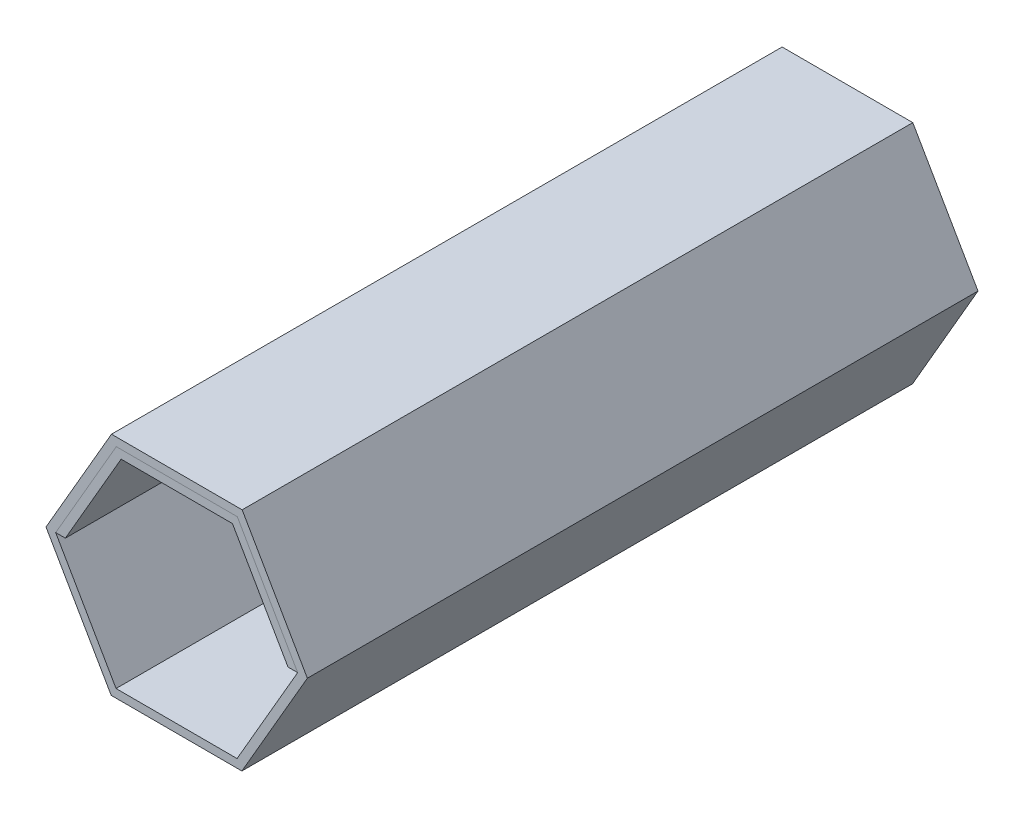
ISO-10303-21;
HEADER;
FILE_DESCRIPTION(('STEP AP214'),'2;1');
FILE_NAME('part.step','',(''),(''),'','','');
FILE_SCHEMA(('AUTOMOTIVE_DESIGN { 1 0 10303 214 1 1 1 1 }'));
ENDSEC;
DATA;
#1=APPLICATION_CONTEXT('core data for automotive mechanical design processes');
#2=APPLICATION_PROTOCOL_DEFINITION('international standard','automotive_design',2000,#1);
#3=PRODUCT_CONTEXT('',#1,'mechanical');
#4=PRODUCT('Part','Part','',(#3));
#5=PRODUCT_RELATED_PRODUCT_CATEGORY('part','',(#4));
#6=PRODUCT_DEFINITION_FORMATION('','',#4);
#7=PRODUCT_DEFINITION_CONTEXT('part definition',#1,'design');
#8=PRODUCT_DEFINITION('design','',#6,#7);
#9=PRODUCT_DEFINITION_SHAPE('','',#8);
#10=(LENGTH_UNIT() NAMED_UNIT(*) SI_UNIT(.MILLI.,.METRE.));
#11=(NAMED_UNIT(*) PLANE_ANGLE_UNIT() SI_UNIT($,.RADIAN.));
#12=(NAMED_UNIT(*) SI_UNIT($,.STERADIAN.) SOLID_ANGLE_UNIT());
#13=UNCERTAINTY_MEASURE_WITH_UNIT(LENGTH_MEASURE(1.E-05),#10,'distance_accuracy_value','');
#14=(GEOMETRIC_REPRESENTATION_CONTEXT(3) GLOBAL_UNCERTAINTY_ASSIGNED_CONTEXT((#13)) GLOBAL_UNIT_ASSIGNED_CONTEXT((#10,
#11,#12)) REPRESENTATION_CONTEXT('',''));
#15=CARTESIAN_POINT('',(0.,0.,0.));
#16=DIRECTION('',(0.,0.,1.));
#17=DIRECTION('',(1.,0.,0.));
#18=AXIS2_PLACEMENT_3D('',#15,#16,#17);
#19=CARTESIAN_POINT('',(-10.8178285685141,6.26295338177121,80.));
#20=DIRECTION('',(0.865426285481131,-0.501036270541697,0.));
#21=DIRECTION('',(0.501036270541697,0.865426285481131,0.));
#22=AXIS2_PLACEMENT_3D('',#19,#20,#21);
#23=PLANE('',#22);
#24=DIRECTION('',(-0.501036270541697,-0.865426285481131,0.));
#25=VECTOR('',#24,1.);
#26=CARTESIAN_POINT('',(-10.8178285685141,6.26295338177121,0.));
#27=LINE('',#26,#25);
#28=CARTESIAN_POINT('',(-7.20191074762645,12.5086296178501,0.));
#29=VERTEX_POINT('',#28);
#30=CARTESIAN_POINT('',(-14.4337463894018,0.017277145692351,0.));
#31=VERTEX_POINT('',#30);
#32=EDGE_CURVE('E161',#29,#31,#27,.T.);
#33=ORIENTED_EDGE('',*,*,#32,.T.);
#34=DIRECTION('',(0.,0.,-1.));
#35=VECTOR('',#34,1.);
#36=CARTESIAN_POINT('',(-14.4337463894018,0.017277145692351,80.));
#37=LINE('',#36,#35);
#38=CARTESIAN_POINT('',(-14.4337463894018,0.017277145692351,80.));
#39=VERTEX_POINT('',#38);
#40=EDGE_CURVE('E12',#39,#31,#37,.T.);
#41=ORIENTED_EDGE('',*,*,#40,.F.);
#42=DIRECTION('',(-0.501036270541697,-0.865426285481131,0.));
#43=VECTOR('',#42,1.);
#44=CARTESIAN_POINT('',(-10.8178285685141,6.26295338177121,80.));
#45=LINE('',#44,#43);
#46=CARTESIAN_POINT('',(-7.20191074762645,12.5086296178501,80.));
#47=VERTEX_POINT('',#46);
#48=EDGE_CURVE('E179',#47,#39,#45,.T.);
#49=ORIENTED_EDGE('',*,*,#48,.F.);
#50=DIRECTION('',(0.,0.,-1.));
#51=VECTOR('',#50,1.);
#52=CARTESIAN_POINT('',(-7.20191074762645,12.5086296178501,80.));
#53=LINE('',#52,#51);
#54=EDGE_CURVE('E160',#47,#29,#53,.T.);
#55=ORIENTED_EDGE('',*,*,#54,.T.);
#56=EDGE_LOOP('',(#33,#41,#49,#55));
#57=FACE_BOUND('',#56,.T.);
#58=ADVANCED_FACE('F63',(#57),#23,.F.);
#59=CARTESIAN_POINT('',(0.,0.017277145692349,80.));
#60=DIRECTION('',(0.,1.,0.));
#61=DIRECTION('',(-1.,0.,0.));
#62=AXIS2_PLACEMENT_3D('',#59,#60,#61);
#63=PLANE('',#62);
#64=DIRECTION('',(1.,0.,0.));
#65=VECTOR('',#64,1.);
#66=CARTESIAN_POINT('',(0.,0.017277145692349,0.));
#67=LINE('',#66,#65);
#68=CARTESIAN_POINT('',(-13.2782464736071,0.017277145692351,0.));
#69=VERTEX_POINT('',#68);
#70=EDGE_CURVE('E164',#31,#69,#67,.T.);
#71=ORIENTED_EDGE('',*,*,#70,.T.);
#72=DIRECTION('',(0.,0.,-1.));
#73=VECTOR('',#72,1.);
#74=CARTESIAN_POINT('',(-13.2782464736071,0.017277145692351,80.));
#75=LINE('',#74,#73);
#76=CARTESIAN_POINT('',(-13.2782464736071,0.017277145692351,80.));
#77=VERTEX_POINT('',#76);
#78=EDGE_CURVE('E71',#77,#69,#75,.T.);
#79=ORIENTED_EDGE('',*,*,#78,.F.);
#80=DIRECTION('',(1.,0.,0.));
#81=VECTOR('',#80,1.);
#82=CARTESIAN_POINT('',(0.,0.017277145692349,80.));
#83=LINE('',#82,#81);
#84=EDGE_CURVE('E121',#39,#77,#83,.T.);
#85=ORIENTED_EDGE('',*,*,#84,.F.);
#86=ORIENTED_EDGE('',*,*,#40,.T.);
#87=EDGE_LOOP('',(#71,#79,#85,#86));
#88=FACE_BOUND('',#87,.T.);
#89=ADVANCED_FACE('F192',(#88),#63,.F.);
#90=CARTESIAN_POINT('',(-9.952402283033,5.76191711122951,80.));
#91=DIRECTION('',(0.865426285481131,-0.501036270541697,0.));
#92=DIRECTION('',(0.501036270541697,0.865426285481131,0.));
#93=AXIS2_PLACEMENT_3D('',#90,#91,#92);
#94=PLANE('',#93);
#95=DIRECTION('',(-0.501036270541697,-0.865426285481131,0.));
#96=VECTOR('',#95,1.);
#97=CARTESIAN_POINT('',(-9.952402283033,5.76191711122951,0.));
#98=LINE('',#97,#96);
#99=CARTESIAN_POINT('',(-6.62575788781633,11.5079392484221,0.));
#100=VERTEX_POINT('',#99);
#101=EDGE_CURVE('E167',#100,#69,#98,.T.);
#102=ORIENTED_EDGE('',*,*,#101,.F.);
#103=DIRECTION('',(0.,0.,-1.));
#104=VECTOR('',#103,1.);
#105=CARTESIAN_POINT('',(-6.62575788781633,11.5079392484221,80.));
#106=LINE('',#105,#104);
#107=CARTESIAN_POINT('',(-6.62575788781633,11.5079392484221,80.));
#108=VERTEX_POINT('',#107);
#109=EDGE_CURVE('E185',#108,#100,#106,.T.);
#110=ORIENTED_EDGE('',*,*,#109,.F.);
#111=DIRECTION('',(-0.501036270541697,-0.865426285481131,0.));
#112=VECTOR('',#111,1.);
#113=CARTESIAN_POINT('',(-9.952402283033,5.76191711122951,80.));
#114=LINE('',#113,#112);
#115=EDGE_CURVE('E191',#108,#77,#114,.T.);
#116=ORIENTED_EDGE('',*,*,#115,.T.);
#117=ORIENTED_EDGE('',*,*,#78,.T.);
#118=EDGE_LOOP('',(#102,#110,#116,#117));
#119=FACE_BOUND('',#118,.T.);
#120=ADVANCED_FACE('F189',(#119),#94,.T.);
#121=CARTESIAN_POINT('',(0.0137654513085009,11.4999917614036,80.));
#122=DIRECTION('',(-0.0011969957659566,-0.999999283600312,0.));
#123=DIRECTION('',(0.999999283600312,-0.0011969957659566,0.));
#124=AXIS2_PLACEMENT_3D('',#121,#122,#123);
#125=PLANE('',#124);
#126=DIRECTION('',(-0.999999283600312,0.0011969957659566,0.));
#127=VECTOR('',#126,1.);
#128=CARTESIAN_POINT('',(0.0137654513085009,11.4999917614036,0.));
#129=LINE('',#128,#127);
#130=CARTESIAN_POINT('',(6.65328879043334,11.4920442743851,0.));
#131=VERTEX_POINT('',#130);
#132=EDGE_CURVE('E170',#131,#100,#129,.T.);
#133=ORIENTED_EDGE('',*,*,#132,.F.);
#134=DIRECTION('',(0.,0.,-1.));
#135=VECTOR('',#134,1.);
#136=CARTESIAN_POINT('',(6.65328879043334,11.4920442743851,80.));
#137=LINE('',#136,#135);
#138=CARTESIAN_POINT('',(6.65328879043334,11.4920442743851,80.));
#139=VERTEX_POINT('',#138);
#140=EDGE_CURVE('E183',#139,#131,#137,.T.);
#141=ORIENTED_EDGE('',*,*,#140,.F.);
#142=DIRECTION('',(-0.999999283600312,0.0011969957659566,0.));
#143=VECTOR('',#142,1.);
#144=CARTESIAN_POINT('',(0.0137654513085009,11.4999917614036,80.));
#145=LINE('',#144,#143);
#146=EDGE_CURVE('E155',#139,#108,#145,.T.);
#147=ORIENTED_EDGE('',*,*,#146,.T.);
#148=ORIENTED_EDGE('',*,*,#109,.T.);
#149=EDGE_LOOP('',(#133,#141,#147,#148));
#150=FACE_BOUND('',#149,.T.);
#151=ADVANCED_FACE('F200',(#150),#125,.T.);
#152=CARTESIAN_POINT('',(9.9661677343415,5.73807465017407,80.));
#153=DIRECTION('',(-0.866623281247087,-0.498963013058615,0.));
#154=DIRECTION('',(0.498963013058615,-0.866623281247087,0.));
#155=AXIS2_PLACEMENT_3D('',#152,#153,#154);
#156=PLANE('',#155);
#157=DIRECTION('',(-0.498963013058615,0.866623281247087,0.));
#158=VECTOR('',#157,1.);
#159=CARTESIAN_POINT('',(9.9661677343415,5.73807465017407,0.));
#160=LINE('',#159,#158);
#161=CARTESIAN_POINT('',(13.2798424710107,-0.0172771456923517,0.));
#162=VERTEX_POINT('',#161);
#163=EDGE_CURVE('E173',#162,#131,#160,.T.);
#164=ORIENTED_EDGE('',*,*,#163,.F.);
#165=DIRECTION('',(0.,0.,-1.));
#166=VECTOR('',#165,1.);
#167=CARTESIAN_POINT('',(13.2798424710107,-0.0172771456923517,80.));
#168=LINE('',#167,#166);
#169=CARTESIAN_POINT('',(13.2798424710107,-0.0172771456923517,80.));
#170=VERTEX_POINT('',#169);
#171=EDGE_CURVE('E143',#170,#162,#168,.T.);
#172=ORIENTED_EDGE('',*,*,#171,.F.);
#173=DIRECTION('',(-0.498963013058615,0.866623281247087,0.));
#174=VECTOR('',#173,1.);
#175=CARTESIAN_POINT('',(9.9661677343415,5.73807465017407,80.));
#176=LINE('',#175,#174);
#177=EDGE_CURVE('E153',#170,#139,#176,.T.);
#178=ORIENTED_EDGE('',*,*,#177,.T.);
#179=ORIENTED_EDGE('',*,*,#140,.T.);
#180=EDGE_LOOP('',(#164,#172,#178,#179));
#181=FACE_BOUND('',#180,.T.);
#182=ADVANCED_FACE('F230',(#181),#156,.T.);
#183=CARTESIAN_POINT('',(0.,-0.0172771456923529,80.));
#184=DIRECTION('',(0.,-1.,0.));
#185=DIRECTION('',(1.,0.,0.));
#186=AXIS2_PLACEMENT_3D('',#183,#184,#185);
#187=PLANE('',#186);
#188=DIRECTION('',(-1.,0.,0.));
#189=VECTOR('',#188,1.);
#190=CARTESIAN_POINT('',(0.,-0.0172771456923529,0.));
#191=LINE('',#190,#189);
#192=CARTESIAN_POINT('',(14.4337463894018,-0.0172771456923519,0.));
#193=VERTEX_POINT('',#192);
#194=EDGE_CURVE('E142',#193,#162,#191,.T.);
#195=ORIENTED_EDGE('',*,*,#194,.F.);
#196=DIRECTION('',(0.,0.,-1.));
#197=VECTOR('',#196,1.);
#198=CARTESIAN_POINT('',(14.4337463894018,-0.0172771456923519,80.));
#199=LINE('',#198,#197);
#200=CARTESIAN_POINT('',(14.4337463894018,-0.0172771456923519,80.));
#201=VERTEX_POINT('',#200);
#202=EDGE_CURVE('E136',#201,#193,#199,.T.);
#203=ORIENTED_EDGE('',*,*,#202,.F.);
#204=DIRECTION('',(-1.,0.,0.));
#205=VECTOR('',#204,1.);
#206=CARTESIAN_POINT('',(0.,-0.0172771456923529,80.));
#207=LINE('',#206,#205);
#208=EDGE_CURVE('E140',#201,#170,#207,.T.);
#209=ORIENTED_EDGE('',*,*,#208,.T.);
#210=ORIENTED_EDGE('',*,*,#171,.T.);
#211=EDGE_LOOP('',(#195,#203,#209,#210));
#212=FACE_BOUND('',#211,.T.);
#213=ADVANCED_FACE('F138',(#212),#187,.T.);
#214=CARTESIAN_POINT('',(10.8327910155886,6.23703766323269,80.));
#215=DIRECTION('',(-0.866623281247087,-0.498963013058615,0.));
#216=DIRECTION('',(0.498963013058615,-0.866623281247087,0.));
#217=AXIS2_PLACEMENT_3D('',#214,#215,#216);
#218=PLANE('',#217);
#219=DIRECTION('',(-0.498963013058615,0.866623281247087,0.));
#220=VECTOR('',#219,1.);
#221=CARTESIAN_POINT('',(10.8327910155886,6.23703766323269,0.));
#222=LINE('',#221,#220);
#223=CARTESIAN_POINT('',(7.23183564177536,12.4913524721577,0.));
#224=VERTEX_POINT('',#223);
#225=EDGE_CURVE('E107',#193,#224,#222,.T.);
#226=ORIENTED_EDGE('',*,*,#225,.T.);
#227=DIRECTION('',(0.,0.,-1.));
#228=VECTOR('',#227,1.);
#229=CARTESIAN_POINT('',(7.23183564177536,12.4913524721577,80.));
#230=LINE('',#229,#228);
#231=CARTESIAN_POINT('',(7.23183564177536,12.4913524721577,80.));
#232=VERTEX_POINT('',#231);
#233=EDGE_CURVE('E144',#232,#224,#230,.T.);
#234=ORIENTED_EDGE('',*,*,#233,.F.);
#235=DIRECTION('',(-0.498963013058615,0.866623281247087,0.));
#236=VECTOR('',#235,1.);
#237=CARTESIAN_POINT('',(10.8327910155886,6.23703766323269,80.));
#238=LINE('',#237,#236);
#239=EDGE_CURVE('E146',#201,#232,#238,.T.);
#240=ORIENTED_EDGE('',*,*,#239,.F.);
#241=ORIENTED_EDGE('',*,*,#202,.T.);
#242=EDGE_LOOP('',(#226,#234,#240,#241));
#243=FACE_BOUND('',#242,.T.);
#244=ADVANCED_FACE('F147',(#243),#218,.F.);
#245=CARTESIAN_POINT('',(0.0149624470744586,12.4999910450039,80.));
#246=DIRECTION('',(-0.00119699576595669,-0.999999283600312,0.));
#247=DIRECTION('',(0.999999283600312,-0.00119699576595669,0.));
#248=AXIS2_PLACEMENT_3D('',#245,#246,#247);
#249=PLANE('',#248);
#250=DIRECTION('',(-0.999999283600312,0.00119699576595669,0.));
#251=VECTOR('',#250,1.);
#252=CARTESIAN_POINT('',(0.0149624470744586,12.4999910450039,0.));
#253=LINE('',#252,#251);
#254=EDGE_CURVE('E113',#224,#29,#253,.T.);
#255=ORIENTED_EDGE('',*,*,#254,.T.);
#256=ORIENTED_EDGE('',*,*,#54,.F.);
#257=DIRECTION('',(-0.999999283600312,0.00119699576595669,0.));
#258=VECTOR('',#257,1.);
#259=CARTESIAN_POINT('',(0.0149624470744586,12.4999910450039,80.));
#260=LINE('',#259,#258);
#261=EDGE_CURVE('E79',#232,#47,#260,.T.);
#262=ORIENTED_EDGE('',*,*,#261,.F.);
#263=ORIENTED_EDGE('',*,*,#233,.T.);
#264=EDGE_LOOP('',(#255,#256,#262,#263));
#265=FACE_BOUND('',#264,.T.);
#266=ADVANCED_FACE('F207',(#265),#249,.F.);
#267=CARTESIAN_POINT('',(0.,0.,80.));
#268=DIRECTION('',(0.,0.,1.));
#269=DIRECTION('',(1.,0.,0.));
#270=AXIS2_PLACEMENT_3D('',#267,#268,#269);
#271=PLANE('',#270);
#272=ORIENTED_EDGE('',*,*,#48,.T.);
#273=ORIENTED_EDGE('',*,*,#84,.T.);
#274=ORIENTED_EDGE('',*,*,#115,.F.);
#275=ORIENTED_EDGE('',*,*,#146,.F.);
#276=ORIENTED_EDGE('',*,*,#177,.F.);
#277=ORIENTED_EDGE('',*,*,#208,.F.);
#278=ORIENTED_EDGE('',*,*,#239,.T.);
#279=ORIENTED_EDGE('',*,*,#261,.T.);
#280=EDGE_LOOP('',(#272,#273,#274,#275,#276,#277,#278,#279));
#281=FACE_BOUND('',#280,.T.);
#282=ADVANCED_FACE('F150',(#281),#271,.T.);
#283=CARTESIAN_POINT('',(0.,0.,0.));
#284=DIRECTION('',(0.,0.,1.));
#285=DIRECTION('',(1.,0.,0.));
#286=AXIS2_PLACEMENT_3D('',#283,#284,#285);
#287=PLANE('',#286);
#288=ORIENTED_EDGE('',*,*,#32,.F.);
#289=ORIENTED_EDGE('',*,*,#254,.F.);
#290=ORIENTED_EDGE('',*,*,#225,.F.);
#291=ORIENTED_EDGE('',*,*,#194,.T.);
#292=ORIENTED_EDGE('',*,*,#163,.T.);
#293=ORIENTED_EDGE('',*,*,#132,.T.);
#294=ORIENTED_EDGE('',*,*,#101,.T.);
#295=ORIENTED_EDGE('',*,*,#70,.F.);
#296=EDGE_LOOP('',(#288,#289,#290,#291,#292,#293,#294,#295));
#297=FACE_BOUND('',#296,.T.);
#298=ADVANCED_FACE('F196',(#297),#287,.F.);
#299=CLOSED_SHELL('',(#58,#89,#120,#151,#182,#213,#244,#266,#282,#298));
#300=MANIFOLD_SOLID_BREP('B2',#299);
#301=CARTESIAN_POINT('',(11.6832548539953,-6.7639896523129,80.));
#302=DIRECTION('',(-0.865426285481131,0.501036270541697,0.));
#303=DIRECTION('',(-0.501036270541697,-0.865426285481131,0.));
#304=AXIS2_PLACEMENT_3D('',#301,#302,#303);
#305=PLANE('',#304);
#306=DIRECTION('',(0.501036270541697,0.865426285481131,0.));
#307=VECTOR('',#306,1.);
#308=CARTESIAN_POINT('',(11.6832548539953,-6.7639896523129,0.));
#309=LINE('',#308,#307);
#310=CARTESIAN_POINT('',(7.77806360743657,-13.5093199872781,0.));
#311=VERTEX_POINT('',#310);
#312=CARTESIAN_POINT('',(15.588446100554,-0.0186593173477391,0.));
#313=VERTEX_POINT('',#312);
#314=EDGE_CURVE('E486',#311,#313,#309,.T.);
#315=ORIENTED_EDGE('',*,*,#314,.T.);
#316=DIRECTION('',(0.,0.,-1.));
#317=VECTOR('',#316,1.);
#318=CARTESIAN_POINT('',(15.588446100554,-0.0186593173477391,80.));
#319=LINE('',#318,#317);
#320=CARTESIAN_POINT('',(15.588446100554,-0.0186593173477391,80.));
#321=VERTEX_POINT('',#320);
#322=EDGE_CURVE('E61',#321,#313,#319,.T.);
#323=ORIENTED_EDGE('',*,*,#322,.F.);
#324=DIRECTION('',(0.501036270541697,0.865426285481131,0.));
#325=VECTOR('',#324,1.);
#326=CARTESIAN_POINT('',(11.6832548539953,-6.7639896523129,80.));
#327=LINE('',#326,#325);
#328=CARTESIAN_POINT('',(7.77806360743657,-13.5093199872781,80.));
#329=VERTEX_POINT('',#328);
#330=EDGE_CURVE('E564',#329,#321,#327,.T.);
#331=ORIENTED_EDGE('',*,*,#330,.F.);
#332=DIRECTION('',(0.,0.,-1.));
#333=VECTOR('',#332,1.);
#334=CARTESIAN_POINT('',(7.77806360743657,-13.5093199872781,80.));
#335=LINE('',#334,#333);
#336=EDGE_CURVE('E503',#329,#311,#335,.T.);
#337=ORIENTED_EDGE('',*,*,#336,.T.);
#338=EDGE_LOOP('',(#315,#323,#331,#337));
#339=FACE_BOUND('',#338,.T.);
#340=ADVANCED_FACE('F333',(#339),#305,.F.);
#341=CARTESIAN_POINT('',(11.6994142968357,6.7360006762913,80.));
#342=DIRECTION('',(-0.866623281247087,-0.498963013058615,0.));
#343=DIRECTION('',(0.498963013058615,-0.866623281247087,0.));
#344=AXIS2_PLACEMENT_3D('',#341,#342,#343);
#345=PLANE('',#344);
#346=DIRECTION('',(-0.498963013058615,0.866623281247087,0.));
#347=VECTOR('',#346,1.);
#348=CARTESIAN_POINT('',(11.6994142968357,6.7360006762913,0.));
#349=LINE('',#348,#347);
#350=CARTESIAN_POINT('',(7.81038249311739,13.4906606699303,0.));
#351=VERTEX_POINT('',#350);
#352=EDGE_CURVE('E490',#313,#351,#349,.T.);
#353=ORIENTED_EDGE('',*,*,#352,.T.);
#354=DIRECTION('',(0.,0.,-1.));
#355=VECTOR('',#354,1.);
#356=CARTESIAN_POINT('',(7.81038249311739,13.4906606699303,80.));
#357=LINE('',#356,#355);
#358=CARTESIAN_POINT('',(7.81038249311739,13.4906606699303,80.));
#359=VERTEX_POINT('',#358);
#360=EDGE_CURVE('E344',#359,#351,#357,.T.);
#361=ORIENTED_EDGE('',*,*,#360,.F.);
#362=DIRECTION('',(-0.498963013058615,0.866623281247087,0.));
#363=VECTOR('',#362,1.);
#364=CARTESIAN_POINT('',(11.6994142968357,6.7360006762913,80.));
#365=LINE('',#364,#363);
#366=EDGE_CURVE('E567',#321,#359,#365,.T.);
#367=ORIENTED_EDGE('',*,*,#366,.F.);
#368=ORIENTED_EDGE('',*,*,#322,.T.);
#369=EDGE_LOOP('',(#353,#361,#367,#368));
#370=FACE_BOUND('',#369,.T.);
#371=ADVANCED_FACE('F574',(#370),#345,.F.);
#372=CARTESIAN_POINT('',(0.0161594428404147,13.4999903286042,80.));
#373=DIRECTION('',(-0.00119699576595665,-0.999999283600312,0.));
#374=DIRECTION('',(0.999999283600312,-0.00119699576595665,0.));
#375=AXIS2_PLACEMENT_3D('',#372,#373,#374);
#376=PLANE('',#375);
#377=DIRECTION('',(-0.999999283600312,0.00119699576595665,0.));
#378=VECTOR('',#377,1.);
#379=CARTESIAN_POINT('',(0.0161594428404147,13.4999903286042,0.));
#380=LINE('',#379,#378);
#381=CARTESIAN_POINT('',(-7.77806360743656,13.5093199872781,0.));
#382=VERTEX_POINT('',#381);
#383=EDGE_CURVE('E493',#351,#382,#380,.T.);
#384=ORIENTED_EDGE('',*,*,#383,.T.);
#385=DIRECTION('',(0.,0.,-1.));
#386=VECTOR('',#385,1.);
#387=CARTESIAN_POINT('',(-7.77806360743656,13.5093199872781,80.));
#388=LINE('',#387,#386);
#389=CARTESIAN_POINT('',(-7.77806360743656,13.5093199872781,80.));
#390=VERTEX_POINT('',#389);
#391=EDGE_CURVE('E451',#390,#382,#388,.T.);
#392=ORIENTED_EDGE('',*,*,#391,.F.);
#393=DIRECTION('',(-0.999999283600312,0.00119699576595665,0.));
#394=VECTOR('',#393,1.);
#395=CARTESIAN_POINT('',(0.0161594428404147,13.4999903286042,80.));
#396=LINE('',#395,#394);
#397=EDGE_CURVE('E440',#359,#390,#396,.T.);
#398=ORIENTED_EDGE('',*,*,#397,.F.);
#399=ORIENTED_EDGE('',*,*,#360,.T.);
#400=EDGE_LOOP('',(#384,#392,#398,#399));
#401=FACE_BOUND('',#400,.T.);
#402=ADVANCED_FACE('F577',(#401),#376,.F.);
#403=CARTESIAN_POINT('',(-11.6832548539953,6.76398965231291,80.));
#404=DIRECTION('',(0.865426285481131,-0.501036270541697,0.));
#405=DIRECTION('',(0.501036270541697,0.865426285481131,0.));
#406=AXIS2_PLACEMENT_3D('',#403,#404,#405);
#407=PLANE('',#406);
#408=DIRECTION('',(-0.501036270541697,-0.865426285481131,0.));
#409=VECTOR('',#408,1.);
#410=CARTESIAN_POINT('',(-11.6832548539953,6.76398965231291,0.));
#411=LINE('',#410,#409);
#412=CARTESIAN_POINT('',(-15.588446100554,0.01865931734774,0.));
#413=VERTEX_POINT('',#412);
#414=EDGE_CURVE('E449',#382,#413,#411,.T.);
#415=ORIENTED_EDGE('',*,*,#414,.T.);
#416=DIRECTION('',(0.,0.,-1.));
#417=VECTOR('',#416,1.);
#418=CARTESIAN_POINT('',(-15.588446100554,0.01865931734774,80.));
#419=LINE('',#418,#417);
#420=CARTESIAN_POINT('',(-15.588446100554,0.01865931734774,80.));
#421=VERTEX_POINT('',#420);
#422=EDGE_CURVE('E446',#421,#413,#419,.T.);
#423=ORIENTED_EDGE('',*,*,#422,.F.);
#424=DIRECTION('',(-0.501036270541697,-0.865426285481131,0.));
#425=VECTOR('',#424,1.);
#426=CARTESIAN_POINT('',(-11.6832548539953,6.76398965231291,80.));
#427=LINE('',#426,#425);
#428=EDGE_CURVE('E434',#390,#421,#427,.T.);
#429=ORIENTED_EDGE('',*,*,#428,.F.);
#430=ORIENTED_EDGE('',*,*,#391,.T.);
#431=EDGE_LOOP('',(#415,#423,#429,#430));
#432=FACE_BOUND('',#431,.T.);
#433=ADVANCED_FACE('F447',(#432),#407,.F.);
#434=CARTESIAN_POINT('',(-11.6994142968357,-6.7360006762913,80.));
#435=DIRECTION('',(0.866623281247088,0.498963013058615,0.));
#436=DIRECTION('',(-0.498963013058615,0.866623281247088,0.));
#437=AXIS2_PLACEMENT_3D('',#434,#435,#436);
#438=PLANE('',#437);
#439=DIRECTION('',(0.498963013058615,-0.866623281247088,0.));
#440=VECTOR('',#439,1.);
#441=CARTESIAN_POINT('',(-11.6994142968357,-6.7360006762913,0.));
#442=LINE('',#441,#440);
#443=CARTESIAN_POINT('',(-7.8103824931174,-13.4906606699303,0.));
#444=VERTEX_POINT('',#443);
#445=EDGE_CURVE('E394',#413,#444,#442,.T.);
#446=ORIENTED_EDGE('',*,*,#445,.T.);
#447=DIRECTION('',(0.,0.,-1.));
#448=VECTOR('',#447,1.);
#449=CARTESIAN_POINT('',(-7.8103824931174,-13.4906606699303,80.));
#450=LINE('',#449,#448);
#451=CARTESIAN_POINT('',(-7.8103824931174,-13.4906606699303,80.));
#452=VERTEX_POINT('',#451);
#453=EDGE_CURVE('E452',#452,#444,#450,.T.);
#454=ORIENTED_EDGE('',*,*,#453,.F.);
#455=DIRECTION('',(0.498963013058615,-0.866623281247088,0.));
#456=VECTOR('',#455,1.);
#457=CARTESIAN_POINT('',(-11.6994142968357,-6.7360006762913,80.));
#458=LINE('',#457,#456);
#459=EDGE_CURVE('E438',#421,#452,#458,.T.);
#460=ORIENTED_EDGE('',*,*,#459,.F.);
#461=ORIENTED_EDGE('',*,*,#422,.T.);
#462=EDGE_LOOP('',(#446,#454,#460,#461));
#463=FACE_BOUND('',#462,.T.);
#464=ADVANCED_FACE('F454',(#463),#438,.F.);
#465=CARTESIAN_POINT('',(10.8327910155886,6.23703766323269,80.));
#466=DIRECTION('',(-0.866623281247087,-0.498963013058615,0.));
#467=DIRECTION('',(0.498963013058615,-0.866623281247087,0.));
#468=AXIS2_PLACEMENT_3D('',#465,#466,#467);
#469=PLANE('',#468);
#470=DIRECTION('',(-0.498963013058615,0.866623281247087,0.));
#471=VECTOR('',#470,1.);
#472=CARTESIAN_POINT('',(10.8327910155886,6.23703766323269,0.));
#473=LINE('',#472,#471);
#474=CARTESIAN_POINT('',(14.4337463894018,-0.0172771456923519,0.));
#475=VERTEX_POINT('',#474);
#476=CARTESIAN_POINT('',(7.23183564177536,12.4913524721577,0.));
#477=VERTEX_POINT('',#476);
#478=EDGE_CURVE('E462',#475,#477,#473,.T.);
#479=ORIENTED_EDGE('',*,*,#478,.F.);
#480=DIRECTION('',(0.,0.,-1.));
#481=VECTOR('',#480,1.);
#482=CARTESIAN_POINT('',(14.4337463894018,-0.0172771456923519,80.));
#483=LINE('',#482,#481);
#484=CARTESIAN_POINT('',(14.4337463894018,-0.0172771456923519,80.));
#485=VERTEX_POINT('',#484);
#486=EDGE_CURVE('E337',#485,#475,#483,.T.);
#487=ORIENTED_EDGE('',*,*,#486,.F.);
#488=DIRECTION('',(-0.498963013058615,0.866623281247087,0.));
#489=VECTOR('',#488,1.);
#490=CARTESIAN_POINT('',(10.8327910155886,6.23703766323269,80.));
#491=LINE('',#490,#489);
#492=CARTESIAN_POINT('',(7.23183564177536,12.4913524721577,80.));
#493=VERTEX_POINT('',#492);
#494=EDGE_CURVE('E502',#485,#493,#491,.T.);
#495=ORIENTED_EDGE('',*,*,#494,.T.);
#496=DIRECTION('',(0.,0.,-1.));
#497=VECTOR('',#496,1.);
#498=CARTESIAN_POINT('',(7.23183564177536,12.4913524721577,80.));
#499=LINE('',#498,#497);
#500=EDGE_CURVE('E458',#493,#477,#499,.T.);
#501=ORIENTED_EDGE('',*,*,#500,.T.);
#502=EDGE_LOOP('',(#479,#487,#495,#501));
#503=FACE_BOUND('',#502,.T.);
#504=ADVANCED_FACE('F335',(#503),#469,.T.);
#505=CARTESIAN_POINT('',(10.8178285685141,-6.26295338177121,80.));
#506=DIRECTION('',(-0.865426285481131,0.501036270541697,0.));
#507=DIRECTION('',(-0.501036270541697,-0.865426285481131,0.));
#508=AXIS2_PLACEMENT_3D('',#505,#506,#507);
#509=PLANE('',#508);
#510=DIRECTION('',(0.501036270541697,0.865426285481131,0.));
#511=VECTOR('',#510,1.);
#512=CARTESIAN_POINT('',(10.8178285685141,-6.26295338177121,0.));
#513=LINE('',#512,#511);
#514=CARTESIAN_POINT('',(7.20191074762645,-12.5086296178501,0.));
#515=VERTEX_POINT('',#514);
#516=EDGE_CURVE('E466',#515,#475,#513,.T.);
#517=ORIENTED_EDGE('',*,*,#516,.F.);
#518=DIRECTION('',(0.,0.,-1.));
#519=VECTOR('',#518,1.);
#520=CARTESIAN_POINT('',(7.20191074762645,-12.5086296178501,80.));
#521=LINE('',#520,#519);
#522=CARTESIAN_POINT('',(7.20191074762645,-12.5086296178501,80.));
#523=VERTEX_POINT('',#522);
#524=EDGE_CURVE('E523',#523,#515,#521,.T.);
#525=ORIENTED_EDGE('',*,*,#524,.F.);
#526=DIRECTION('',(0.501036270541697,0.865426285481131,0.));
#527=VECTOR('',#526,1.);
#528=CARTESIAN_POINT('',(10.8178285685141,-6.26295338177121,80.));
#529=LINE('',#528,#527);
#530=EDGE_CURVE('E534',#523,#485,#529,.T.);
#531=ORIENTED_EDGE('',*,*,#530,.T.);
#532=ORIENTED_EDGE('',*,*,#486,.T.);
#533=EDGE_LOOP('',(#517,#525,#531,#532));
#534=FACE_BOUND('',#533,.T.);
#535=ADVANCED_FACE('F532',(#534),#509,.T.);
#536=CARTESIAN_POINT('',(-0.0149624470744571,-12.4999910450039,80.));
#537=DIRECTION('',(0.00119699576595657,0.999999283600312,0.));
#538=DIRECTION('',(-0.999999283600312,0.00119699576595657,0.));
#539=AXIS2_PLACEMENT_3D('',#536,#537,#538);
#540=PLANE('',#539);
#541=DIRECTION('',(0.999999283600312,-0.00119699576595657,0.));
#542=VECTOR('',#541,1.);
#543=CARTESIAN_POINT('',(-0.0149624470744571,-12.4999910450039,0.));
#544=LINE('',#543,#542);
#545=CARTESIAN_POINT('',(-7.23183564177537,-12.4913524721577,0.));
#546=VERTEX_POINT('',#545);
#547=EDGE_CURVE('E470',#546,#515,#544,.T.);
#548=ORIENTED_EDGE('',*,*,#547,.F.);
#549=DIRECTION('',(0.,0.,-1.));
#550=VECTOR('',#549,1.);
#551=CARTESIAN_POINT('',(-7.23183564177537,-12.4913524721577,80.));
#552=LINE('',#551,#550);
#553=CARTESIAN_POINT('',(-7.23183564177537,-12.4913524721577,80.));
#554=VERTEX_POINT('',#553);
#555=EDGE_CURVE('E521',#554,#546,#552,.T.);
#556=ORIENTED_EDGE('',*,*,#555,.F.);
#557=DIRECTION('',(0.999999283600312,-0.00119699576595657,0.));
#558=VECTOR('',#557,1.);
#559=CARTESIAN_POINT('',(-0.0149624470744571,-12.4999910450039,80.));
#560=LINE('',#559,#558);
#561=EDGE_CURVE('E542',#554,#523,#560,.T.);
#562=ORIENTED_EDGE('',*,*,#561,.T.);
#563=ORIENTED_EDGE('',*,*,#524,.T.);
#564=EDGE_LOOP('',(#548,#556,#562,#563));
#565=FACE_BOUND('',#564,.T.);
#566=ADVANCED_FACE('F540',(#565),#540,.T.);
#567=CARTESIAN_POINT('',(-10.8327910155886,-6.23703766323269,80.));
#568=DIRECTION('',(0.866623281247087,0.498963013058615,0.));
#569=DIRECTION('',(-0.498963013058615,0.866623281247087,0.));
#570=AXIS2_PLACEMENT_3D('',#567,#568,#569);
#571=PLANE('',#570);
#572=DIRECTION('',(0.498963013058615,-0.866623281247087,0.));
#573=VECTOR('',#572,1.);
#574=CARTESIAN_POINT('',(-10.8327910155886,-6.23703766323269,0.));
#575=LINE('',#574,#573);
#576=CARTESIAN_POINT('',(-14.4337463894018,0.017277145692351,0.));
#577=VERTEX_POINT('',#576);
#578=EDGE_CURVE('E474',#577,#546,#575,.T.);
#579=ORIENTED_EDGE('',*,*,#578,.F.);
#580=DIRECTION('',(0.,0.,-1.));
#581=VECTOR('',#580,1.);
#582=CARTESIAN_POINT('',(-14.4337463894018,0.017277145692351,80.));
#583=LINE('',#582,#581);
#584=CARTESIAN_POINT('',(-14.4337463894018,0.017277145692351,80.));
#585=VERTEX_POINT('',#584);
#586=EDGE_CURVE('E518',#585,#577,#583,.T.);
#587=ORIENTED_EDGE('',*,*,#586,.F.);
#588=DIRECTION('',(0.498963013058615,-0.866623281247087,0.));
#589=VECTOR('',#588,1.);
#590=CARTESIAN_POINT('',(-10.8327910155886,-6.23703766323269,80.));
#591=LINE('',#590,#589);
#592=EDGE_CURVE('E548',#585,#554,#591,.T.);
#593=ORIENTED_EDGE('',*,*,#592,.T.);
#594=ORIENTED_EDGE('',*,*,#555,.T.);
#595=EDGE_LOOP('',(#579,#587,#593,#594));
#596=FACE_BOUND('',#595,.T.);
#597=ADVANCED_FACE('F552',(#596),#571,.T.);
#598=CARTESIAN_POINT('',(-10.8178285685141,6.26295338177121,80.));
#599=DIRECTION('',(0.865426285481131,-0.501036270541697,0.));
#600=DIRECTION('',(0.501036270541697,0.865426285481131,0.));
#601=AXIS2_PLACEMENT_3D('',#598,#599,#600);
#602=PLANE('',#601);
#603=DIRECTION('',(-0.501036270541697,-0.865426285481131,0.));
#604=VECTOR('',#603,1.);
#605=CARTESIAN_POINT('',(-10.8178285685141,6.26295338177121,0.));
#606=LINE('',#605,#604);
#607=CARTESIAN_POINT('',(-7.20191074762645,12.5086296178501,0.));
#608=VERTEX_POINT('',#607);
#609=EDGE_CURVE('E478',#608,#577,#606,.T.);
#610=ORIENTED_EDGE('',*,*,#609,.F.);
#611=DIRECTION('',(0.,0.,-1.));
#612=VECTOR('',#611,1.);
#613=CARTESIAN_POINT('',(-7.20191074762645,12.5086296178501,80.));
#614=LINE('',#613,#612);
#615=CARTESIAN_POINT('',(-7.20191074762645,12.5086296178501,80.));
#616=VERTEX_POINT('',#615);
#617=EDGE_CURVE('E515',#616,#608,#614,.T.);
#618=ORIENTED_EDGE('',*,*,#617,.F.);
#619=DIRECTION('',(-0.501036270541697,-0.865426285481131,0.));
#620=VECTOR('',#619,1.);
#621=CARTESIAN_POINT('',(-10.8178285685141,6.26295338177121,80.));
#622=LINE('',#621,#620);
#623=EDGE_CURVE('E554',#616,#585,#622,.T.);
#624=ORIENTED_EDGE('',*,*,#623,.T.);
#625=ORIENTED_EDGE('',*,*,#586,.T.);
#626=EDGE_LOOP('',(#610,#618,#624,#625));
#627=FACE_BOUND('',#626,.T.);
#628=ADVANCED_FACE('F589',(#627),#602,.T.);
#629=CARTESIAN_POINT('',(0.0149624470744586,12.4999910450039,80.));
#630=DIRECTION('',(-0.00119699576595669,-0.999999283600312,0.));
#631=DIRECTION('',(0.999999283600312,-0.00119699576595669,0.));
#632=AXIS2_PLACEMENT_3D('',#629,#630,#631);
#633=PLANE('',#632);
#634=DIRECTION('',(-0.999999283600312,0.00119699576595669,0.));
#635=VECTOR('',#634,1.);
#636=CARTESIAN_POINT('',(0.0149624470744586,12.4999910450039,0.));
#637=LINE('',#636,#635);
#638=EDGE_CURVE('E482',#477,#608,#637,.T.);
#639=ORIENTED_EDGE('',*,*,#638,.F.);
#640=ORIENTED_EDGE('',*,*,#500,.F.);
#641=DIRECTION('',(-0.999999283600312,0.00119699576595669,0.));
#642=VECTOR('',#641,1.);
#643=CARTESIAN_POINT('',(0.0149624470744586,12.4999910450039,80.));
#644=LINE('',#643,#642);
#645=EDGE_CURVE('E557',#493,#616,#644,.T.);
#646=ORIENTED_EDGE('',*,*,#645,.T.);
#647=ORIENTED_EDGE('',*,*,#617,.T.);
#648=EDGE_LOOP('',(#639,#640,#646,#647));
#649=FACE_BOUND('',#648,.T.);
#650=ADVANCED_FACE('F582',(#649),#633,.T.);
#651=CARTESIAN_POINT('',(-0.0161594428404147,-13.4999903286042,80.));
#652=DIRECTION('',(0.00119699576595665,0.999999283600312,0.));
#653=DIRECTION('',(-0.999999283600312,0.00119699576595665,0.));
#654=AXIS2_PLACEMENT_3D('',#651,#652,#653);
#655=PLANE('',#654);
#656=DIRECTION('',(0.999999283600312,-0.00119699576595665,0.));
#657=VECTOR('',#656,1.);
#658=CARTESIAN_POINT('',(-0.0161594428404147,-13.4999903286042,0.));
#659=LINE('',#658,#657);
#660=EDGE_CURVE('E400',#444,#311,#659,.T.);
#661=ORIENTED_EDGE('',*,*,#660,.T.);
#662=ORIENTED_EDGE('',*,*,#336,.F.);
#663=DIRECTION('',(0.999999283600312,-0.00119699576595665,0.));
#664=VECTOR('',#663,1.);
#665=CARTESIAN_POINT('',(-0.0161594428404147,-13.4999903286042,80.));
#666=LINE('',#665,#664);
#667=EDGE_CURVE('E353',#452,#329,#666,.T.);
#668=ORIENTED_EDGE('',*,*,#667,.F.);
#669=ORIENTED_EDGE('',*,*,#453,.T.);
#670=EDGE_LOOP('',(#661,#662,#668,#669));
#671=FACE_BOUND('',#670,.T.);
#672=ADVANCED_FACE('F580',(#671),#655,.F.);
#673=CARTESIAN_POINT('',(0.,0.,80.));
#674=DIRECTION('',(0.,0.,1.));
#675=DIRECTION('',(1.,0.,0.));
#676=AXIS2_PLACEMENT_3D('',#673,#674,#675);
#677=PLANE('',#676);
#678=ORIENTED_EDGE('',*,*,#494,.F.);
#679=ORIENTED_EDGE('',*,*,#530,.F.);
#680=ORIENTED_EDGE('',*,*,#561,.F.);
#681=ORIENTED_EDGE('',*,*,#592,.F.);
#682=ORIENTED_EDGE('',*,*,#623,.F.);
#683=ORIENTED_EDGE('',*,*,#645,.F.);
#684=EDGE_LOOP('',(#678,#679,#680,#681,#682,#683));
#685=FACE_BOUND('',#684,.T.);
#686=ORIENTED_EDGE('',*,*,#330,.T.);
#687=ORIENTED_EDGE('',*,*,#366,.T.);
#688=ORIENTED_EDGE('',*,*,#397,.T.);
#689=ORIENTED_EDGE('',*,*,#428,.T.);
#690=ORIENTED_EDGE('',*,*,#459,.T.);
#691=ORIENTED_EDGE('',*,*,#667,.T.);
#692=EDGE_LOOP('',(#686,#687,#688,#689,#690,#691));
#693=FACE_BOUND('',#692,.T.);
#694=ADVANCED_FACE('F436',(#685,#693),#677,.T.);
#695=CARTESIAN_POINT('',(0.,0.,0.));
#696=DIRECTION('',(0.,0.,1.));
#697=DIRECTION('',(1.,0.,0.));
#698=AXIS2_PLACEMENT_3D('',#695,#696,#697);
#699=PLANE('',#698);
#700=ORIENTED_EDGE('',*,*,#478,.T.);
#701=ORIENTED_EDGE('',*,*,#638,.T.);
#702=ORIENTED_EDGE('',*,*,#609,.T.);
#703=ORIENTED_EDGE('',*,*,#578,.T.);
#704=ORIENTED_EDGE('',*,*,#547,.T.);
#705=ORIENTED_EDGE('',*,*,#516,.T.);
#706=EDGE_LOOP('',(#700,#701,#702,#703,#704,#705));
#707=FACE_BOUND('',#706,.T.);
#708=ORIENTED_EDGE('',*,*,#314,.F.);
#709=ORIENTED_EDGE('',*,*,#660,.F.);
#710=ORIENTED_EDGE('',*,*,#445,.F.);
#711=ORIENTED_EDGE('',*,*,#414,.F.);
#712=ORIENTED_EDGE('',*,*,#383,.F.);
#713=ORIENTED_EDGE('',*,*,#352,.F.);
#714=EDGE_LOOP('',(#708,#709,#710,#711,#712,#713));
#715=FACE_BOUND('',#714,.T.);
#716=ADVANCED_FACE('F537',(#707,#715),#699,.F.);
#717=CLOSED_SHELL('',(#340,#371,#402,#433,#464,#504,#535,#566,#597,#628,#650,#672,#694,#716));
#718=MANIFOLD_SOLID_BREP('B6',#717);
#719=ADVANCED_BREP_SHAPE_REPRESENTATION('',(#18,#300,#718),#14);
#720=SHAPE_DEFINITION_REPRESENTATION(#9,#719);
ENDSEC;
END-ISO-10303-21;
